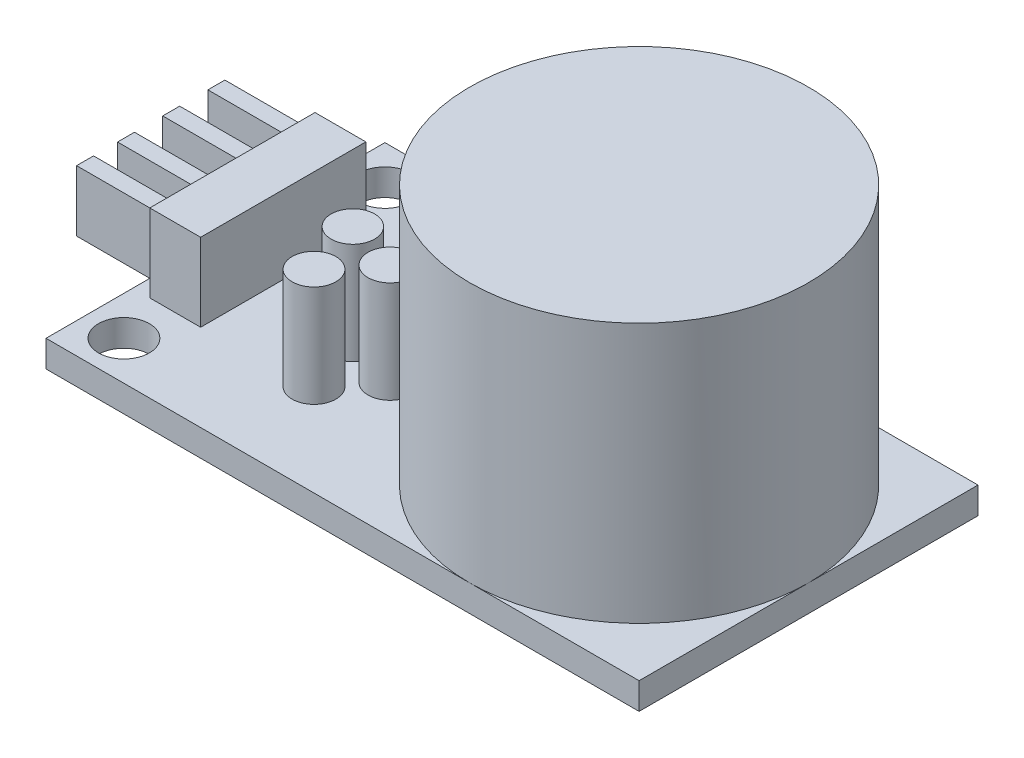
ISO-10303-21;
HEADER;
FILE_DESCRIPTION(('STEP AP214'),'2;1');
FILE_NAME('part.step','',(''),(''),'','','');
FILE_SCHEMA(('AUTOMOTIVE_DESIGN { 1 0 10303 214 1 1 1 1 }'));
ENDSEC;
DATA;
#1=APPLICATION_CONTEXT('core data for automotive mechanical design processes');
#2=APPLICATION_PROTOCOL_DEFINITION('international standard','automotive_design',2000,#1);
#3=PRODUCT_CONTEXT('',#1,'mechanical');
#4=PRODUCT('Part','Part','',(#3));
#5=PRODUCT_RELATED_PRODUCT_CATEGORY('part','',(#4));
#6=PRODUCT_DEFINITION_FORMATION('','',#4);
#7=PRODUCT_DEFINITION_CONTEXT('part definition',#1,'design');
#8=PRODUCT_DEFINITION('design','',#6,#7);
#9=PRODUCT_DEFINITION_SHAPE('','',#8);
#10=(LENGTH_UNIT() NAMED_UNIT(*) SI_UNIT(.MILLI.,.METRE.));
#11=(NAMED_UNIT(*) PLANE_ANGLE_UNIT() SI_UNIT($,.RADIAN.));
#12=(NAMED_UNIT(*) SI_UNIT($,.STERADIAN.) SOLID_ANGLE_UNIT());
#13=UNCERTAINTY_MEASURE_WITH_UNIT(LENGTH_MEASURE(1.E-05),#10,'distance_accuracy_value','');
#14=(GEOMETRIC_REPRESENTATION_CONTEXT(3) GLOBAL_UNCERTAINTY_ASSIGNED_CONTEXT((#13)) GLOBAL_UNIT_ASSIGNED_CONTEXT((#10,
#11,#12)) REPRESENTATION_CONTEXT('',''));
#15=CARTESIAN_POINT('',(0.,0.,0.));
#16=DIRECTION('',(0.,0.,1.));
#17=DIRECTION('',(1.,0.,0.));
#18=AXIS2_PLACEMENT_3D('',#15,#16,#17);
#19=CARTESIAN_POINT('',(-3.81999999999998,2.07,-14.375));
#20=DIRECTION('',(0.,1.,0.));
#21=DIRECTION('',(0.,0.,1.));
#22=AXIS2_PLACEMENT_3D('',#19,#20,#21);
#23=PLANE('',#22);
#24=DIRECTION('',(0.,0.,1.));
#25=VECTOR('',#24,1.);
#26=CARTESIAN_POINT('',(-3.81999999999998,2.07,-14.375));
#27=LINE('',#26,#25);
#28=CARTESIAN_POINT('',(-3.81999999999998,2.07,-11.7083333333333));
#29=VERTEX_POINT('',#28);
#30=CARTESIAN_POINT('',(-3.81999999999998,2.07,-10.7083333333333));
#31=VERTEX_POINT('',#30);
#32=EDGE_CURVE('E220',#29,#31,#27,.T.);
#33=ORIENTED_EDGE('',*,*,#32,.F.);
#34=DIRECTION('',(-1.,0.,0.));
#35=VECTOR('',#34,1.);
#36=CARTESIAN_POINT('',(4.96708681248318,2.07,-11.7083333333333));
#37=LINE('',#36,#35);
#38=CARTESIAN_POINT('',(1.00000000000002,2.07,-11.7083333333333));
#39=VERTEX_POINT('',#38);
#40=EDGE_CURVE('E205',#39,#29,#37,.T.);
#41=ORIENTED_EDGE('',*,*,#40,.F.);
#42=DIRECTION('',(0.,0.,1.));
#43=VECTOR('',#42,1.);
#44=CARTESIAN_POINT('',(1.00000000000002,2.07,-14.375));
#45=LINE('',#44,#43);
#46=CARTESIAN_POINT('',(1.00000000000002,2.07,-10.7083333333333));
#47=VERTEX_POINT('',#46);
#48=EDGE_CURVE('E218',#39,#47,#45,.T.);
#49=ORIENTED_EDGE('',*,*,#48,.T.);
#50=DIRECTION('',(-1.,0.,0.));
#51=VECTOR('',#50,1.);
#52=CARTESIAN_POINT('',(4.96708681248318,2.07,-10.7083333333333));
#53=LINE('',#52,#51);
#54=EDGE_CURVE('E463',#47,#31,#53,.T.);
#55=ORIENTED_EDGE('',*,*,#54,.T.);
#56=EDGE_LOOP('',(#33,#41,#49,#55));
#57=FACE_BOUND('',#56,.T.);
#58=ADVANCED_FACE('F33',(#57),#23,.F.);
#59=CARTESIAN_POINT('',(-3.81999999999998,2.07,-9.04166666666666));
#60=VERTEX_POINT('',#59);
#61=CARTESIAN_POINT('',(-3.81999999999998,2.07,-8.04166666666666));
#62=VERTEX_POINT('',#61);
#63=EDGE_CURVE('E444',#60,#62,#27,.T.);
#64=ORIENTED_EDGE('',*,*,#63,.F.);
#65=DIRECTION('',(-1.,0.,0.));
#66=VECTOR('',#65,1.);
#67=CARTESIAN_POINT('',(4.96708681248318,2.07,-9.04166666666666));
#68=LINE('',#67,#66);
#69=CARTESIAN_POINT('',(1.00000000000002,2.07,-9.04166666666666));
#70=VERTEX_POINT('',#69);
#71=EDGE_CURVE('E478',#70,#60,#68,.T.);
#72=ORIENTED_EDGE('',*,*,#71,.F.);
#73=CARTESIAN_POINT('',(1.00000000000002,2.07,-8.04166666666666));
#74=VERTEX_POINT('',#73);
#75=EDGE_CURVE('E228',#70,#74,#45,.T.);
#76=ORIENTED_EDGE('',*,*,#75,.T.);
#77=DIRECTION('',(-1.,0.,0.));
#78=VECTOR('',#77,1.);
#79=CARTESIAN_POINT('',(4.96708681248318,2.07,-8.04166666666666));
#80=LINE('',#79,#78);
#81=EDGE_CURVE('E480',#74,#62,#80,.T.);
#82=ORIENTED_EDGE('',*,*,#81,.T.);
#83=EDGE_LOOP('',(#64,#72,#76,#82));
#84=FACE_BOUND('',#83,.T.);
#85=ADVANCED_FACE('F405',(#84),#23,.F.);
#86=CARTESIAN_POINT('',(-3.81999999999998,2.07,-6.625));
#87=VERTEX_POINT('',#86);
#88=CARTESIAN_POINT('',(-3.81999999999998,2.07,-5.625));
#89=VERTEX_POINT('',#88);
#90=EDGE_CURVE('E438',#87,#89,#27,.T.);
#91=ORIENTED_EDGE('',*,*,#90,.F.);
#92=DIRECTION('',(-1.,0.,0.));
#93=VECTOR('',#92,1.);
#94=CARTESIAN_POINT('',(4.96708681248318,2.07,-6.625));
#95=LINE('',#94,#93);
#96=CARTESIAN_POINT('',(1.00000000000002,2.07,-6.625));
#97=VERTEX_POINT('',#96);
#98=EDGE_CURVE('E439',#97,#87,#95,.T.);
#99=ORIENTED_EDGE('',*,*,#98,.F.);
#100=CARTESIAN_POINT('',(1.00000000000002,2.07,-5.625));
#101=VERTEX_POINT('',#100);
#102=EDGE_CURVE('E232',#97,#101,#45,.T.);
#103=ORIENTED_EDGE('',*,*,#102,.T.);
#104=DIRECTION('',(1.,0.,0.));
#105=VECTOR('',#104,1.);
#106=CARTESIAN_POINT('',(-3.81999999999998,2.07,-5.625));
#107=LINE('',#106,#105);
#108=EDGE_CURVE('E253',#89,#101,#107,.T.);
#109=ORIENTED_EDGE('',*,*,#108,.F.);
#110=EDGE_LOOP('',(#91,#99,#103,#109));
#111=FACE_BOUND('',#110,.T.);
#112=ADVANCED_FACE('F411',(#111),#23,.F.);
#113=CARTESIAN_POINT('',(-3.81999999999998,5.67,-14.375));
#114=DIRECTION('',(0.,-1.,0.));
#115=DIRECTION('',(0.,0.,-1.));
#116=AXIS2_PLACEMENT_3D('',#113,#114,#115);
#117=PLANE('',#116);
#118=DIRECTION('',(0.,0.,-1.));
#119=VECTOR('',#118,1.);
#120=CARTESIAN_POINT('',(1.00000000000002,5.67,-14.375));
#121=LINE('',#120,#119);
#122=CARTESIAN_POINT('',(1.00000000000002,5.67,-10.7083333333333));
#123=VERTEX_POINT('',#122);
#124=CARTESIAN_POINT('',(1.00000000000002,5.67,-11.7083333333333));
#125=VERTEX_POINT('',#124);
#126=EDGE_CURVE('E525',#123,#125,#121,.T.);
#127=ORIENTED_EDGE('',*,*,#126,.T.);
#128=DIRECTION('',(-1.,0.,0.));
#129=VECTOR('',#128,1.);
#130=CARTESIAN_POINT('',(4.96708681248318,5.67,-11.7083333333333));
#131=LINE('',#130,#129);
#132=CARTESIAN_POINT('',(-3.81999999999998,5.67,-11.7083333333333));
#133=VERTEX_POINT('',#132);
#134=EDGE_CURVE('E208',#125,#133,#131,.T.);
#135=ORIENTED_EDGE('',*,*,#134,.T.);
#136=DIRECTION('',(0.,0.,-1.));
#137=VECTOR('',#136,1.);
#138=CARTESIAN_POINT('',(-3.81999999999998,5.67,-14.375));
#139=LINE('',#138,#137);
#140=CARTESIAN_POINT('',(-3.81999999999998,5.67,-10.7083333333333));
#141=VERTEX_POINT('',#140);
#142=EDGE_CURVE('E460',#141,#133,#139,.T.);
#143=ORIENTED_EDGE('',*,*,#142,.F.);
#144=DIRECTION('',(-1.,0.,0.));
#145=VECTOR('',#144,1.);
#146=CARTESIAN_POINT('',(4.96708681248318,5.67,-10.7083333333333));
#147=LINE('',#146,#145);
#148=EDGE_CURVE('E56',#123,#141,#147,.T.);
#149=ORIENTED_EDGE('',*,*,#148,.F.);
#150=EDGE_LOOP('',(#127,#135,#143,#149));
#151=FACE_BOUND('',#150,.T.);
#152=ADVANCED_FACE('F427',(#151),#117,.F.);
#153=CARTESIAN_POINT('',(1.00000000000002,5.67,-8.04166666666666));
#154=VERTEX_POINT('',#153);
#155=CARTESIAN_POINT('',(1.00000000000002,5.67,-9.04166666666666));
#156=VERTEX_POINT('',#155);
#157=EDGE_CURVE('E245',#154,#156,#121,.T.);
#158=ORIENTED_EDGE('',*,*,#157,.T.);
#159=DIRECTION('',(-1.,0.,0.));
#160=VECTOR('',#159,1.);
#161=CARTESIAN_POINT('',(4.96708681248318,5.67,-9.04166666666666));
#162=LINE('',#161,#160);
#163=CARTESIAN_POINT('',(-3.81999999999998,5.67,-9.04166666666666));
#164=VERTEX_POINT('',#163);
#165=EDGE_CURVE('E485',#156,#164,#162,.T.);
#166=ORIENTED_EDGE('',*,*,#165,.T.);
#167=CARTESIAN_POINT('',(-3.81999999999998,5.67,-8.04166666666666));
#168=VERTEX_POINT('',#167);
#169=EDGE_CURVE('E518',#168,#164,#139,.T.);
#170=ORIENTED_EDGE('',*,*,#169,.F.);
#171=DIRECTION('',(-1.,0.,0.));
#172=VECTOR('',#171,1.);
#173=CARTESIAN_POINT('',(4.96708681248318,5.67,-8.04166666666666));
#174=LINE('',#173,#172);
#175=EDGE_CURVE('E497',#154,#168,#174,.T.);
#176=ORIENTED_EDGE('',*,*,#175,.F.);
#177=EDGE_LOOP('',(#158,#166,#170,#176));
#178=FACE_BOUND('',#177,.T.);
#179=ADVANCED_FACE('F432',(#178),#117,.F.);
#180=CARTESIAN_POINT('',(1.00000000000002,5.67,-5.625));
#181=VERTEX_POINT('',#180);
#182=CARTESIAN_POINT('',(1.00000000000002,5.67,-6.625));
#183=VERTEX_POINT('',#182);
#184=EDGE_CURVE('E241',#181,#183,#121,.T.);
#185=ORIENTED_EDGE('',*,*,#184,.T.);
#186=DIRECTION('',(-1.,0.,0.));
#187=VECTOR('',#186,1.);
#188=CARTESIAN_POINT('',(4.96708681248318,5.67,-6.625));
#189=LINE('',#188,#187);
#190=CARTESIAN_POINT('',(-3.81999999999998,5.67,-6.625));
#191=VERTEX_POINT('',#190);
#192=EDGE_CURVE('E501',#183,#191,#189,.T.);
#193=ORIENTED_EDGE('',*,*,#192,.T.);
#194=CARTESIAN_POINT('',(-3.81999999999998,5.67,-5.625));
#195=VERTEX_POINT('',#194);
#196=EDGE_CURVE('E250',#195,#191,#139,.T.);
#197=ORIENTED_EDGE('',*,*,#196,.F.);
#198=DIRECTION('',(1.,0.,0.));
#199=VECTOR('',#198,1.);
#200=CARTESIAN_POINT('',(-3.81999999999998,5.67,-5.625));
#201=LINE('',#200,#199);
#202=EDGE_CURVE('E249',#195,#181,#201,.T.);
#203=ORIENTED_EDGE('',*,*,#202,.T.);
#204=EDGE_LOOP('',(#185,#193,#197,#203));
#205=FACE_BOUND('',#204,.T.);
#206=ADVANCED_FACE('F540',(#205),#117,.F.);
#207=CARTESIAN_POINT('',(-3.81999999999998,0.,0.));
#208=DIRECTION('',(-1.,0.,0.));
#209=DIRECTION('',(0.,0.,1.));
#210=AXIS2_PLACEMENT_3D('',#207,#208,#209);
#211=PLANE('',#210);
#212=DIRECTION('',(0.,1.,0.));
#213=VECTOR('',#212,1.);
#214=CARTESIAN_POINT('',(-3.81999999999998,5.67,-11.7083333333333));
#215=LINE('',#214,#213);
#216=EDGE_CURVE('E221',#29,#133,#215,.T.);
#217=ORIENTED_EDGE('',*,*,#216,.F.);
#218=ORIENTED_EDGE('',*,*,#32,.T.);
#219=DIRECTION('',(0.,-1.,0.));
#220=VECTOR('',#219,1.);
#221=CARTESIAN_POINT('',(-3.81999999999998,5.67,-10.7083333333333));
#222=LINE('',#221,#220);
#223=EDGE_CURVE('E458',#141,#31,#222,.T.);
#224=ORIENTED_EDGE('',*,*,#223,.F.);
#225=ORIENTED_EDGE('',*,*,#142,.T.);
#226=EDGE_LOOP('',(#217,#218,#224,#225));
#227=FACE_BOUND('',#226,.T.);
#228=ADVANCED_FACE('F456',(#227),#211,.T.);
#229=DIRECTION('',(0.,1.,0.));
#230=VECTOR('',#229,1.);
#231=CARTESIAN_POINT('',(-3.81999999999998,5.67,-9.04166666666666));
#232=LINE('',#231,#230);
#233=EDGE_CURVE('E476',#60,#164,#232,.T.);
#234=ORIENTED_EDGE('',*,*,#233,.F.);
#235=ORIENTED_EDGE('',*,*,#63,.T.);
#236=DIRECTION('',(0.,-1.,0.));
#237=VECTOR('',#236,1.);
#238=CARTESIAN_POINT('',(-3.81999999999998,5.67,-8.04166666666666));
#239=LINE('',#238,#237);
#240=EDGE_CURVE('E493',#168,#62,#239,.T.);
#241=ORIENTED_EDGE('',*,*,#240,.F.);
#242=ORIENTED_EDGE('',*,*,#169,.T.);
#243=EDGE_LOOP('',(#234,#235,#241,#242));
#244=FACE_BOUND('',#243,.T.);
#245=ADVANCED_FACE('F515',(#244),#211,.T.);
#246=DIRECTION('',(0.,1.,0.));
#247=VECTOR('',#246,1.);
#248=CARTESIAN_POINT('',(-3.81999999999998,5.67,-6.625));
#249=LINE('',#248,#247);
#250=EDGE_CURVE('E491',#87,#191,#249,.T.);
#251=ORIENTED_EDGE('',*,*,#250,.F.);
#252=ORIENTED_EDGE('',*,*,#90,.T.);
#253=DIRECTION('',(0.,1.,0.));
#254=VECTOR('',#253,1.);
#255=CARTESIAN_POINT('',(-3.81999999999998,5.67,-5.625));
#256=LINE('',#255,#254);
#257=EDGE_CURVE('E452',#89,#195,#256,.T.);
#258=ORIENTED_EDGE('',*,*,#257,.T.);
#259=ORIENTED_EDGE('',*,*,#196,.T.);
#260=EDGE_LOOP('',(#251,#252,#258,#259));
#261=FACE_BOUND('',#260,.T.);
#262=ADVANCED_FACE('F537',(#261),#211,.T.);
#263=CARTESIAN_POINT('',(1.00000000000002,6.17,-14.875));
#264=DIRECTION('',(1.,0.,0.));
#265=DIRECTION('',(0.,0.,-1.));
#266=AXIS2_PLACEMENT_3D('',#263,#264,#265);
#267=PLANE('',#266);
#268=ORIENTED_EDGE('',*,*,#48,.F.);
#269=DIRECTION('',(0.,1.,0.));
#270=VECTOR('',#269,1.);
#271=CARTESIAN_POINT('',(1.00000000000002,5.67,-11.7083333333333));
#272=LINE('',#271,#270);
#273=EDGE_CURVE('E202',#39,#125,#272,.T.);
#274=ORIENTED_EDGE('',*,*,#273,.T.);
#275=ORIENTED_EDGE('',*,*,#126,.F.);
#276=DIRECTION('',(0.,-1.,0.));
#277=VECTOR('',#276,1.);
#278=CARTESIAN_POINT('',(1.00000000000002,5.67,-10.7083333333333));
#279=LINE('',#278,#277);
#280=EDGE_CURVE('E225',#123,#47,#279,.T.);
#281=ORIENTED_EDGE('',*,*,#280,.T.);
#282=EDGE_LOOP('',(#268,#274,#275,#281));
#283=FACE_BOUND('',#282,.T.);
#284=ORIENTED_EDGE('',*,*,#75,.F.);
#285=DIRECTION('',(0.,1.,0.));
#286=VECTOR('',#285,1.);
#287=CARTESIAN_POINT('',(1.00000000000002,5.67,-9.04166666666666));
#288=LINE('',#287,#286);
#289=EDGE_CURVE('E482',#70,#156,#288,.T.);
#290=ORIENTED_EDGE('',*,*,#289,.T.);
#291=ORIENTED_EDGE('',*,*,#157,.F.);
#292=DIRECTION('',(0.,-1.,0.));
#293=VECTOR('',#292,1.);
#294=CARTESIAN_POINT('',(1.00000000000002,5.67,-8.04166666666666));
#295=LINE('',#294,#293);
#296=EDGE_CURVE('E495',#154,#74,#295,.T.);
#297=ORIENTED_EDGE('',*,*,#296,.T.);
#298=EDGE_LOOP('',(#284,#290,#291,#297));
#299=FACE_BOUND('',#298,.T.);
#300=ORIENTED_EDGE('',*,*,#102,.F.);
#301=DIRECTION('',(0.,1.,0.));
#302=VECTOR('',#301,1.);
#303=CARTESIAN_POINT('',(1.00000000000002,5.67,-6.625));
#304=LINE('',#303,#302);
#305=EDGE_CURVE('E498',#97,#183,#304,.T.);
#306=ORIENTED_EDGE('',*,*,#305,.T.);
#307=ORIENTED_EDGE('',*,*,#184,.F.);
#308=DIRECTION('',(0.,1.,0.));
#309=VECTOR('',#308,1.);
#310=CARTESIAN_POINT('',(1.00000000000002,5.67,-5.625));
#311=LINE('',#310,#309);
#312=EDGE_CURVE('E231',#101,#181,#311,.T.);
#313=ORIENTED_EDGE('',*,*,#312,.F.);
#314=EDGE_LOOP('',(#300,#306,#307,#313));
#315=FACE_BOUND('',#314,.T.);
#316=DIRECTION('',(0.,0.,1.));
#317=VECTOR('',#316,1.);
#318=CARTESIAN_POINT('',(1.00000000000002,1.57,-14.875));
#319=LINE('',#318,#317);
#320=CARTESIAN_POINT('',(1.00000000000002,1.57,-14.875));
#321=VERTEX_POINT('',#320);
#322=CARTESIAN_POINT('',(1.00000000000002,1.57,-5.125));
#323=VERTEX_POINT('',#322);
#324=EDGE_CURVE('E259',#321,#323,#319,.T.);
#325=ORIENTED_EDGE('',*,*,#324,.T.);
#326=DIRECTION('',(0.,-1.,0.));
#327=VECTOR('',#326,1.);
#328=CARTESIAN_POINT('',(1.00000000000002,6.17,-5.125));
#329=LINE('',#328,#327);
#330=CARTESIAN_POINT('',(1.00000000000002,6.17,-5.125));
#331=VERTEX_POINT('',#330);
#332=EDGE_CURVE('E289',#331,#323,#329,.T.);
#333=ORIENTED_EDGE('',*,*,#332,.F.);
#334=DIRECTION('',(0.,0.,1.));
#335=VECTOR('',#334,1.);
#336=CARTESIAN_POINT('',(1.00000000000002,6.17,-14.875));
#337=LINE('',#336,#335);
#338=CARTESIAN_POINT('',(1.00000000000002,6.17,-14.875));
#339=VERTEX_POINT('',#338);
#340=EDGE_CURVE('E260',#339,#331,#337,.T.);
#341=ORIENTED_EDGE('',*,*,#340,.F.);
#342=DIRECTION('',(0.,-1.,0.));
#343=VECTOR('',#342,1.);
#344=CARTESIAN_POINT('',(1.00000000000002,6.17,-14.875));
#345=LINE('',#344,#343);
#346=EDGE_CURVE('E270',#339,#321,#345,.T.);
#347=ORIENTED_EDGE('',*,*,#346,.T.);
#348=EDGE_LOOP('',(#325,#333,#341,#347));
#349=FACE_BOUND('',#348,.T.);
#350=DIRECTION('',(0.,-1.,0.));
#351=VECTOR('',#350,1.);
#352=CARTESIAN_POINT('',(1.00000000000002,5.67,-14.375));
#353=LINE('',#352,#351);
#354=CARTESIAN_POINT('',(1.00000000000002,5.67,-14.375));
#355=VERTEX_POINT('',#354);
#356=CARTESIAN_POINT('',(1.00000000000002,2.07,-14.375));
#357=VERTEX_POINT('',#356);
#358=EDGE_CURVE('E236',#355,#357,#353,.T.);
#359=ORIENTED_EDGE('',*,*,#358,.F.);
#360=CARTESIAN_POINT('',(1.00000000000002,5.67,-13.375));
#361=VERTEX_POINT('',#360);
#362=EDGE_CURVE('E240',#361,#355,#121,.T.);
#363=ORIENTED_EDGE('',*,*,#362,.F.);
#364=DIRECTION('',(0.,-1.,0.));
#365=VECTOR('',#364,1.);
#366=CARTESIAN_POINT('',(1.00000000000002,5.67,-13.375));
#367=LINE('',#366,#365);
#368=CARTESIAN_POINT('',(1.00000000000002,2.07,-13.375));
#369=VERTEX_POINT('',#368);
#370=EDGE_CURVE('E469',#361,#369,#367,.T.);
#371=ORIENTED_EDGE('',*,*,#370,.T.);
#372=EDGE_CURVE('E227',#357,#369,#45,.T.);
#373=ORIENTED_EDGE('',*,*,#372,.F.);
#374=EDGE_LOOP('',(#359,#363,#371,#373));
#375=FACE_BOUND('',#374,.T.);
#376=ADVANCED_FACE('F223',(#283,#299,#315,#349,#375),#267,.F.);
#377=CARTESIAN_POINT('',(0.,1.57,0.));
#378=DIRECTION('',(0.,-1.,0.));
#379=DIRECTION('',(0.,0.,-1.));
#380=AXIS2_PLACEMENT_3D('',#377,#378,#379);
#381=PLANE('',#380);
#382=CARTESIAN_POINT('',(9.34276181516225,1.57,-8.76625566201028));
#383=DIRECTION('',(0.,-1.,0.));
#384=DIRECTION('',(0.,0.,-1.));
#385=AXIS2_PLACEMENT_3D('',#382,#383,#384);
#386=CIRCLE('',#385,1.28479068285538);
#387=CARTESIAN_POINT('',(9.34276181516225,1.57,-10.0510463448657));
#388=VERTEX_POINT('',#387);
#389=EDGE_CURVE('E11',#388,#388,#386,.F.);
#390=ORIENTED_EDGE('',*,*,#389,.F.);
#391=EDGE_LOOP('',(#390));
#392=FACE_BOUND('',#391,.T.);
#393=CARTESIAN_POINT('',(10.3752552563492,1.57,-5.44014545158689));
#394=DIRECTION('',(0.,-1.,0.));
#395=DIRECTION('',(0.,0.,-1.));
#396=AXIS2_PLACEMENT_3D('',#393,#394,#395);
#397=CIRCLE('',#396,1.29100622203504);
#398=CARTESIAN_POINT('',(10.3752552563492,1.57,-6.73115167362192));
#399=VERTEX_POINT('',#398);
#400=EDGE_CURVE('E41',#399,#399,#397,.F.);
#401=ORIENTED_EDGE('',*,*,#400,.F.);
#402=EDGE_LOOP('',(#401));
#403=FACE_BOUND('',#402,.T.);
#404=CARTESIAN_POINT('',(11.5773723259736,1.57,-12.2105368939174));
#405=DIRECTION('',(0.,-1.,0.));
#406=DIRECTION('',(0.,0.,-1.));
#407=AXIS2_PLACEMENT_3D('',#404,#405,#406);
#408=CIRCLE('',#407,1.72084725471488);
#409=CARTESIAN_POINT('',(11.5773723259736,1.57,-13.9313841486323));
#410=VERTEX_POINT('',#409);
#411=EDGE_CURVE('E350',#410,#410,#408,.F.);
#412=ORIENTED_EDGE('',*,*,#411,.F.);
#413=EDGE_LOOP('',(#412));
#414=FACE_BOUND('',#413,.T.);
#415=CARTESIAN_POINT('',(12.40668985821,1.57,-7.89791826849751));
#416=DIRECTION('',(0.,-1.,0.));
#417=DIRECTION('',(0.,0.,-1.));
#418=AXIS2_PLACEMENT_3D('',#415,#416,#417);
#419=CIRCLE('',#418,1.2968940695084);
#420=CARTESIAN_POINT('',(12.40668985821,1.57,-9.1948123380059));
#421=VERTEX_POINT('',#420);
#422=EDGE_CURVE('E347',#421,#421,#419,.F.);
#423=ORIENTED_EDGE('',*,*,#422,.F.);
#424=EDGE_LOOP('',(#423));
#425=FACE_BOUND('',#424,.T.);
#426=CARTESIAN_POINT('',(2.3,1.57,-2.3));
#427=DIRECTION('',(0.,1.,0.));
#428=DIRECTION('',(0.,0.,1.));
#429=AXIS2_PLACEMENT_3D('',#426,#427,#428);
#430=CIRCLE('',#429,1.5);
#431=CARTESIAN_POINT('',(2.3,1.57,-0.8));
#432=VERTEX_POINT('',#431);
#433=EDGE_CURVE('E301',#432,#432,#430,.T.);
#434=ORIENTED_EDGE('',*,*,#433,.F.);
#435=EDGE_LOOP('',(#434));
#436=FACE_BOUND('',#435,.T.);
#437=CARTESIAN_POINT('',(2.3,1.57,-17.7));
#438=DIRECTION('',(0.,1.,0.));
#439=DIRECTION('',(0.,0.,1.));
#440=AXIS2_PLACEMENT_3D('',#437,#438,#439);
#441=CIRCLE('',#440,1.5);
#442=CARTESIAN_POINT('',(2.3,1.57,-16.2));
#443=VERTEX_POINT('',#442);
#444=EDGE_CURVE('E307',#443,#443,#441,.T.);
#445=ORIENTED_EDGE('',*,*,#444,.F.);
#446=EDGE_LOOP('',(#445));
#447=FACE_BOUND('',#446,.T.);
#448=CARTESIAN_POINT('',(25.,1.57,-10.));
#449=DIRECTION('',(0.,1.,0.));
#450=DIRECTION('',(0.,0.,1.));
#451=AXIS2_PLACEMENT_3D('',#448,#449,#450);
#452=CIRCLE('',#451,9.99999999999999);
#453=CARTESIAN_POINT('',(25.,1.57,-20.));
#454=VERTEX_POINT('',#453);
#455=CARTESIAN_POINT('',(25.,1.57,0.));
#456=VERTEX_POINT('',#455);
#457=EDGE_CURVE('E300',#454,#456,#452,.T.);
#458=ORIENTED_EDGE('',*,*,#457,.F.);
#459=DIRECTION('',(-1.,0.,0.));
#460=VECTOR('',#459,1.);
#461=CARTESIAN_POINT('',(0.,1.57,-20.));
#462=LINE('',#461,#460);
#463=CARTESIAN_POINT('',(0.,1.57,-20.));
#464=VERTEX_POINT('',#463);
#465=EDGE_CURVE('E324',#454,#464,#462,.T.);
#466=ORIENTED_EDGE('',*,*,#465,.T.);
#467=DIRECTION('',(0.,0.,1.));
#468=VECTOR('',#467,1.);
#469=CARTESIAN_POINT('',(0.,1.57,0.));
#470=LINE('',#469,#468);
#471=CARTESIAN_POINT('',(0.,1.57,0.));
#472=VERTEX_POINT('',#471);
#473=EDGE_CURVE('E313',#464,#472,#470,.T.);
#474=ORIENTED_EDGE('',*,*,#473,.T.);
#475=DIRECTION('',(1.,0.,0.));
#476=VECTOR('',#475,1.);
#477=CARTESIAN_POINT('',(0.,1.57,0.));
#478=LINE('',#477,#476);
#479=EDGE_CURVE('E318',#472,#456,#478,.T.);
#480=ORIENTED_EDGE('',*,*,#479,.T.);
#481=EDGE_LOOP('',(#458,#466,#474,#480));
#482=FACE_BOUND('',#481,.T.);
#483=ORIENTED_EDGE('',*,*,#324,.F.);
#484=DIRECTION('',(-1.,0.,0.));
#485=VECTOR('',#484,1.);
#486=CARTESIAN_POINT('',(1.00000000000002,1.57,-14.875));
#487=LINE('',#486,#485);
#488=CARTESIAN_POINT('',(4.00000000000002,1.57,-14.875));
#489=VERTEX_POINT('',#488);
#490=EDGE_CURVE('E264',#489,#321,#487,.T.);
#491=ORIENTED_EDGE('',*,*,#490,.F.);
#492=DIRECTION('',(0.,0.,-1.));
#493=VECTOR('',#492,1.);
#494=CARTESIAN_POINT('',(4.00000000000002,1.57,-14.875));
#495=LINE('',#494,#493);
#496=CARTESIAN_POINT('',(4.00000000000002,1.57,-5.125));
#497=VERTEX_POINT('',#496);
#498=EDGE_CURVE('E276',#497,#489,#495,.T.);
#499=ORIENTED_EDGE('',*,*,#498,.F.);
#500=DIRECTION('',(1.,0.,0.));
#501=VECTOR('',#500,1.);
#502=CARTESIAN_POINT('',(1.00000000000002,1.57,-5.125));
#503=LINE('',#502,#501);
#504=EDGE_CURVE('E273',#323,#497,#503,.T.);
#505=ORIENTED_EDGE('',*,*,#504,.F.);
#506=EDGE_LOOP('',(#483,#491,#499,#505));
#507=FACE_BOUND('',#506,.T.);
#508=ADVANCED_FACE('F357',(#392,#403,#414,#425,#436,#447,#482,#507),#381,.F.);
#509=CARTESIAN_POINT('',(35.,1.57,-10.));
#510=VERTEX_POINT('',#509);
#511=EDGE_CURVE('E292',#456,#510,#452,.T.);
#512=ORIENTED_EDGE('',*,*,#511,.F.);
#513=CARTESIAN_POINT('',(35.,1.57,0.));
#514=VERTEX_POINT('',#513);
#515=EDGE_CURVE('E316',#456,#514,#478,.T.);
#516=ORIENTED_EDGE('',*,*,#515,.T.);
#517=DIRECTION('',(0.,0.,-1.));
#518=VECTOR('',#517,1.);
#519=CARTESIAN_POINT('',(35.,1.57,0.));
#520=LINE('',#519,#518);
#521=EDGE_CURVE('E321',#514,#510,#520,.T.);
#522=ORIENTED_EDGE('',*,*,#521,.T.);
#523=EDGE_LOOP('',(#512,#516,#522));
#524=FACE_BOUND('',#523,.T.);
#525=ADVANCED_FACE('F360',(#524),#381,.F.);
#526=EDGE_CURVE('E299',#510,#454,#452,.T.);
#527=ORIENTED_EDGE('',*,*,#526,.F.);
#528=CARTESIAN_POINT('',(35.,1.57,-20.));
#529=VERTEX_POINT('',#528);
#530=EDGE_CURVE('E320',#510,#529,#520,.T.);
#531=ORIENTED_EDGE('',*,*,#530,.T.);
#532=EDGE_CURVE('E325',#529,#454,#462,.T.);
#533=ORIENTED_EDGE('',*,*,#532,.T.);
#534=EDGE_LOOP('',(#527,#531,#533));
#535=FACE_BOUND('',#534,.T.);
#536=ADVANCED_FACE('F363',(#535),#381,.F.);
#537=CARTESIAN_POINT('',(0.,0.,0.));
#538=DIRECTION('',(0.,-1.,0.));
#539=DIRECTION('',(0.,0.,-1.));
#540=AXIS2_PLACEMENT_3D('',#537,#538,#539);
#541=PLANE('',#540);
#542=CARTESIAN_POINT('',(25.,0.,-10.));
#543=DIRECTION('',(0.,-1.,0.));
#544=DIRECTION('',(0.,0.,-1.));
#545=AXIS2_PLACEMENT_3D('',#542,#543,#544);
#546=CIRCLE('',#545,2.5);
#547=CARTESIAN_POINT('',(25.,0.,-12.5));
#548=VERTEX_POINT('',#547);
#549=EDGE_CURVE('E828',#548,#548,#546,.T.);
#550=ORIENTED_EDGE('',*,*,#549,.F.);
#551=EDGE_LOOP('',(#550));
#552=FACE_BOUND('',#551,.T.);
#553=CARTESIAN_POINT('',(2.3,0.,-17.7));
#554=DIRECTION('',(0.,1.,0.));
#555=DIRECTION('',(0.,0.,1.));
#556=AXIS2_PLACEMENT_3D('',#553,#554,#555);
#557=CIRCLE('',#556,1.5);
#558=CARTESIAN_POINT('',(2.3,0.,-16.2));
#559=VERTEX_POINT('',#558);
#560=EDGE_CURVE('E304',#559,#559,#557,.T.);
#561=ORIENTED_EDGE('',*,*,#560,.T.);
#562=EDGE_LOOP('',(#561));
#563=FACE_BOUND('',#562,.T.);
#564=DIRECTION('',(0.,0.,1.));
#565=VECTOR('',#564,1.);
#566=CARTESIAN_POINT('',(0.,0.,0.));
#567=LINE('',#566,#565);
#568=CARTESIAN_POINT('',(0.,0.,-20.));
#569=VERTEX_POINT('',#568);
#570=CARTESIAN_POINT('',(0.,0.,0.));
#571=VERTEX_POINT('',#570);
#572=EDGE_CURVE('E310',#569,#571,#567,.T.);
#573=ORIENTED_EDGE('',*,*,#572,.F.);
#574=DIRECTION('',(-1.,0.,0.));
#575=VECTOR('',#574,1.);
#576=CARTESIAN_POINT('',(0.,0.,-20.));
#577=LINE('',#576,#575);
#578=CARTESIAN_POINT('',(35.,0.,-20.));
#579=VERTEX_POINT('',#578);
#580=EDGE_CURVE('E317',#579,#569,#577,.T.);
#581=ORIENTED_EDGE('',*,*,#580,.F.);
#582=DIRECTION('',(0.,0.,-1.));
#583=VECTOR('',#582,1.);
#584=CARTESIAN_POINT('',(35.,0.,0.));
#585=LINE('',#584,#583);
#586=CARTESIAN_POINT('',(35.,0.,0.));
#587=VERTEX_POINT('',#586);
#588=EDGE_CURVE('E333',#587,#579,#585,.T.);
#589=ORIENTED_EDGE('',*,*,#588,.F.);
#590=DIRECTION('',(1.,0.,0.));
#591=VECTOR('',#590,1.);
#592=CARTESIAN_POINT('',(0.,0.,0.));
#593=LINE('',#592,#591);
#594=EDGE_CURVE('E331',#571,#587,#593,.T.);
#595=ORIENTED_EDGE('',*,*,#594,.F.);
#596=EDGE_LOOP('',(#573,#581,#589,#595));
#597=FACE_BOUND('',#596,.T.);
#598=CARTESIAN_POINT('',(2.3,0.,-2.3));
#599=DIRECTION('',(0.,1.,0.));
#600=DIRECTION('',(0.,0.,1.));
#601=AXIS2_PLACEMENT_3D('',#598,#599,#600);
#602=CIRCLE('',#601,1.5);
#603=CARTESIAN_POINT('',(2.3,0.,-0.8));
#604=VERTEX_POINT('',#603);
#605=EDGE_CURVE('E296',#604,#604,#602,.T.);
#606=ORIENTED_EDGE('',*,*,#605,.T.);
#607=EDGE_LOOP('',(#606));
#608=FACE_BOUND('',#607,.T.);
#609=ADVANCED_FACE('F564',(#552,#563,#597,#608),#541,.T.);
#610=CARTESIAN_POINT('',(0.,1.57,0.));
#611=DIRECTION('',(1.,0.,0.));
#612=DIRECTION('',(0.,0.,-1.));
#613=AXIS2_PLACEMENT_3D('',#610,#611,#612);
#614=PLANE('',#613);
#615=ORIENTED_EDGE('',*,*,#572,.T.);
#616=DIRECTION('',(0.,-1.,0.));
#617=VECTOR('',#616,1.);
#618=CARTESIAN_POINT('',(0.,1.57,0.));
#619=LINE('',#618,#617);
#620=EDGE_CURVE('E344',#472,#571,#619,.T.);
#621=ORIENTED_EDGE('',*,*,#620,.F.);
#622=ORIENTED_EDGE('',*,*,#473,.F.);
#623=DIRECTION('',(0.,-1.,0.));
#624=VECTOR('',#623,1.);
#625=CARTESIAN_POINT('',(0.,1.57,-20.));
#626=LINE('',#625,#624);
#627=EDGE_CURVE('E328',#464,#569,#626,.T.);
#628=ORIENTED_EDGE('',*,*,#627,.T.);
#629=EDGE_LOOP('',(#615,#621,#622,#628));
#630=FACE_BOUND('',#629,.T.);
#631=ADVANCED_FACE('F35',(#630),#614,.F.);
#632=CARTESIAN_POINT('',(0.,1.57,0.));
#633=DIRECTION('',(0.,0.,-1.));
#634=DIRECTION('',(-1.,0.,0.));
#635=AXIS2_PLACEMENT_3D('',#632,#633,#634);
#636=PLANE('',#635);
#637=ORIENTED_EDGE('',*,*,#594,.T.);
#638=DIRECTION('',(0.,-1.,0.));
#639=VECTOR('',#638,1.);
#640=CARTESIAN_POINT('',(35.,1.57,0.));
#641=LINE('',#640,#639);
#642=EDGE_CURVE('E341',#514,#587,#641,.T.);
#643=ORIENTED_EDGE('',*,*,#642,.F.);
#644=ORIENTED_EDGE('',*,*,#515,.F.);
#645=ORIENTED_EDGE('',*,*,#479,.F.);
#646=ORIENTED_EDGE('',*,*,#620,.T.);
#647=EDGE_LOOP('',(#637,#643,#644,#645,#646));
#648=FACE_BOUND('',#647,.T.);
#649=ADVANCED_FACE('F573',(#648),#636,.F.);
#650=CARTESIAN_POINT('',(35.,1.57,0.));
#651=DIRECTION('',(-1.,0.,0.));
#652=DIRECTION('',(0.,0.,1.));
#653=AXIS2_PLACEMENT_3D('',#650,#651,#652);
#654=PLANE('',#653);
#655=ORIENTED_EDGE('',*,*,#588,.T.);
#656=DIRECTION('',(0.,-1.,0.));
#657=VECTOR('',#656,1.);
#658=CARTESIAN_POINT('',(35.,1.57,-20.));
#659=LINE('',#658,#657);
#660=EDGE_CURVE('E338',#529,#579,#659,.T.);
#661=ORIENTED_EDGE('',*,*,#660,.F.);
#662=ORIENTED_EDGE('',*,*,#530,.F.);
#663=ORIENTED_EDGE('',*,*,#521,.F.);
#664=ORIENTED_EDGE('',*,*,#642,.T.);
#665=EDGE_LOOP('',(#655,#661,#662,#663,#664));
#666=FACE_BOUND('',#665,.T.);
#667=ADVANCED_FACE('F570',(#666),#654,.F.);
#668=CARTESIAN_POINT('',(0.,1.57,-20.));
#669=DIRECTION('',(0.,0.,1.));
#670=DIRECTION('',(1.,0.,0.));
#671=AXIS2_PLACEMENT_3D('',#668,#669,#670);
#672=PLANE('',#671);
#673=ORIENTED_EDGE('',*,*,#580,.T.);
#674=ORIENTED_EDGE('',*,*,#627,.F.);
#675=ORIENTED_EDGE('',*,*,#465,.F.);
#676=ORIENTED_EDGE('',*,*,#532,.F.);
#677=ORIENTED_EDGE('',*,*,#660,.T.);
#678=EDGE_LOOP('',(#673,#674,#675,#676,#677));
#679=FACE_BOUND('',#678,.T.);
#680=ADVANCED_FACE('F561',(#679),#672,.F.);
#681=CARTESIAN_POINT('',(2.3,1.57,-17.7));
#682=DIRECTION('',(0.,-1.,0.));
#683=DIRECTION('',(0.,0.,-1.));
#684=AXIS2_PLACEMENT_3D('',#681,#682,#683);
#685=CYLINDRICAL_SURFACE('',#684,1.5);
#686=ORIENTED_EDGE('',*,*,#444,.T.);
#687=EDGE_LOOP('',(#686));
#688=FACE_BOUND('',#687,.T.);
#689=ORIENTED_EDGE('',*,*,#560,.F.);
#690=EDGE_LOOP('',(#689));
#691=FACE_BOUND('',#690,.T.);
#692=ADVANCED_FACE('F558',(#688,#691),#685,.F.);
#693=CARTESIAN_POINT('',(2.3,1.57,-2.3));
#694=DIRECTION('',(0.,-1.,0.));
#695=DIRECTION('',(0.,0.,-1.));
#696=AXIS2_PLACEMENT_3D('',#693,#694,#695);
#697=CYLINDRICAL_SURFACE('',#696,1.5);
#698=ORIENTED_EDGE('',*,*,#433,.T.);
#699=EDGE_LOOP('',(#698));
#700=FACE_BOUND('',#699,.T.);
#701=ORIENTED_EDGE('',*,*,#605,.F.);
#702=EDGE_LOOP('',(#701));
#703=FACE_BOUND('',#702,.T.);
#704=ADVANCED_FACE('F554',(#700,#703),#697,.F.);
#705=CARTESIAN_POINT('',(25.,16.91,-10.));
#706=DIRECTION('',(0.,-1.,0.));
#707=DIRECTION('',(0.,0.,-1.));
#708=AXIS2_PLACEMENT_3D('',#705,#706,#707);
#709=CYLINDRICAL_SURFACE('',#708,9.99999999999999);
#710=CARTESIAN_POINT('',(25.,16.91,-10.));
#711=DIRECTION('',(0.,1.,0.));
#712=DIRECTION('',(0.,0.,1.));
#713=AXIS2_PLACEMENT_3D('',#710,#711,#712);
#714=CIRCLE('',#713,9.99999999999999);
#715=CARTESIAN_POINT('',(25.,16.91,0.));
#716=VERTEX_POINT('',#715);
#717=EDGE_CURVE('E293',#716,#716,#714,.T.);
#718=ORIENTED_EDGE('',*,*,#717,.F.);
#719=EDGE_LOOP('',(#718));
#720=FACE_BOUND('',#719,.T.);
#721=ORIENTED_EDGE('',*,*,#511,.T.);
#722=ORIENTED_EDGE('',*,*,#526,.T.);
#723=ORIENTED_EDGE('',*,*,#457,.T.);
#724=EDGE_LOOP('',(#721,#722,#723));
#725=FACE_BOUND('',#724,.T.);
#726=ADVANCED_FACE('F400',(#720,#725),#709,.T.);
#727=CARTESIAN_POINT('',(25.,16.91,-10.));
#728=DIRECTION('',(0.,1.,0.));
#729=DIRECTION('',(0.,0.,1.));
#730=AXIS2_PLACEMENT_3D('',#727,#728,#729);
#731=PLANE('',#730);
#732=ORIENTED_EDGE('',*,*,#717,.T.);
#733=EDGE_LOOP('',(#732));
#734=FACE_BOUND('',#733,.T.);
#735=ADVANCED_FACE('F393',(#734),#731,.T.);
#736=CARTESIAN_POINT('',(1.00000000000002,6.17,-5.125));
#737=DIRECTION('',(0.,0.,-1.));
#738=DIRECTION('',(-1.,0.,0.));
#739=AXIS2_PLACEMENT_3D('',#736,#737,#738);
#740=PLANE('',#739);
#741=ORIENTED_EDGE('',*,*,#504,.T.);
#742=DIRECTION('',(0.,-1.,0.));
#743=VECTOR('',#742,1.);
#744=CARTESIAN_POINT('',(4.00000000000002,6.17,-5.125));
#745=LINE('',#744,#743);
#746=CARTESIAN_POINT('',(4.00000000000002,6.17,-5.125));
#747=VERTEX_POINT('',#746);
#748=EDGE_CURVE('E286',#747,#497,#745,.T.);
#749=ORIENTED_EDGE('',*,*,#748,.F.);
#750=DIRECTION('',(1.,0.,0.));
#751=VECTOR('',#750,1.);
#752=CARTESIAN_POINT('',(1.00000000000002,6.17,-5.125));
#753=LINE('',#752,#751);
#754=EDGE_CURVE('E263',#331,#747,#753,.T.);
#755=ORIENTED_EDGE('',*,*,#754,.F.);
#756=ORIENTED_EDGE('',*,*,#332,.T.);
#757=EDGE_LOOP('',(#741,#749,#755,#756));
#758=FACE_BOUND('',#757,.T.);
#759=ADVANCED_FACE('F391',(#758),#740,.F.);
#760=CARTESIAN_POINT('',(4.00000000000002,6.17,-14.875));
#761=DIRECTION('',(-1.,0.,0.));
#762=DIRECTION('',(0.,0.,1.));
#763=AXIS2_PLACEMENT_3D('',#760,#761,#762);
#764=PLANE('',#763);
#765=ORIENTED_EDGE('',*,*,#498,.T.);
#766=DIRECTION('',(0.,-1.,0.));
#767=VECTOR('',#766,1.);
#768=CARTESIAN_POINT('',(4.00000000000002,6.17,-14.875));
#769=LINE('',#768,#767);
#770=CARTESIAN_POINT('',(4.00000000000002,6.17,-14.875));
#771=VERTEX_POINT('',#770);
#772=EDGE_CURVE('E283',#771,#489,#769,.T.);
#773=ORIENTED_EDGE('',*,*,#772,.F.);
#774=DIRECTION('',(0.,0.,-1.));
#775=VECTOR('',#774,1.);
#776=CARTESIAN_POINT('',(4.00000000000002,6.17,-14.875));
#777=LINE('',#776,#775);
#778=EDGE_CURVE('E266',#747,#771,#777,.T.);
#779=ORIENTED_EDGE('',*,*,#778,.F.);
#780=ORIENTED_EDGE('',*,*,#748,.T.);
#781=EDGE_LOOP('',(#765,#773,#779,#780));
#782=FACE_BOUND('',#781,.T.);
#783=ADVANCED_FACE('F389',(#782),#764,.F.);
#784=CARTESIAN_POINT('',(1.00000000000002,6.17,-14.875));
#785=DIRECTION('',(0.,0.,1.));
#786=DIRECTION('',(1.,0.,0.));
#787=AXIS2_PLACEMENT_3D('',#784,#785,#786);
#788=PLANE('',#787);
#789=ORIENTED_EDGE('',*,*,#490,.T.);
#790=ORIENTED_EDGE('',*,*,#346,.F.);
#791=DIRECTION('',(-1.,0.,0.));
#792=VECTOR('',#791,1.);
#793=CARTESIAN_POINT('',(1.00000000000002,6.17,-14.875));
#794=LINE('',#793,#792);
#795=EDGE_CURVE('E268',#771,#339,#794,.T.);
#796=ORIENTED_EDGE('',*,*,#795,.F.);
#797=ORIENTED_EDGE('',*,*,#772,.T.);
#798=EDGE_LOOP('',(#789,#790,#796,#797));
#799=FACE_BOUND('',#798,.T.);
#800=ADVANCED_FACE('F379',(#799),#788,.F.);
#801=CARTESIAN_POINT('',(0.,6.17,0.));
#802=DIRECTION('',(0.,1.,0.));
#803=DIRECTION('',(0.,0.,1.));
#804=AXIS2_PLACEMENT_3D('',#801,#802,#803);
#805=PLANE('',#804);
#806=ORIENTED_EDGE('',*,*,#340,.T.);
#807=ORIENTED_EDGE('',*,*,#754,.T.);
#808=ORIENTED_EDGE('',*,*,#778,.T.);
#809=ORIENTED_EDGE('',*,*,#795,.T.);
#810=EDGE_LOOP('',(#806,#807,#808,#809));
#811=FACE_BOUND('',#810,.T.);
#812=ADVANCED_FACE('F385',(#811),#805,.T.);
#813=CARTESIAN_POINT('',(-3.81999999999998,5.67,-14.375));
#814=DIRECTION('',(0.,0.,1.));
#815=DIRECTION('',(1.,0.,0.));
#816=AXIS2_PLACEMENT_3D('',#813,#814,#815);
#817=PLANE('',#816);
#818=ORIENTED_EDGE('',*,*,#358,.T.);
#819=DIRECTION('',(1.,0.,0.));
#820=VECTOR('',#819,1.);
#821=CARTESIAN_POINT('',(-3.81999999999998,2.07,-14.375));
#822=LINE('',#821,#820);
#823=CARTESIAN_POINT('',(-3.81999999999998,2.07,-14.375));
#824=VERTEX_POINT('',#823);
#825=EDGE_CURVE('E256',#824,#357,#822,.T.);
#826=ORIENTED_EDGE('',*,*,#825,.F.);
#827=DIRECTION('',(0.,-1.,0.));
#828=VECTOR('',#827,1.);
#829=CARTESIAN_POINT('',(-3.81999999999998,5.67,-14.375));
#830=LINE('',#829,#828);
#831=CARTESIAN_POINT('',(-3.81999999999998,5.67,-14.375));
#832=VERTEX_POINT('',#831);
#833=EDGE_CURVE('E244',#832,#824,#830,.T.);
#834=ORIENTED_EDGE('',*,*,#833,.F.);
#835=DIRECTION('',(1.,0.,0.));
#836=VECTOR('',#835,1.);
#837=CARTESIAN_POINT('',(-3.81999999999998,5.67,-14.375));
#838=LINE('',#837,#836);
#839=EDGE_CURVE('E246',#832,#355,#838,.T.);
#840=ORIENTED_EDGE('',*,*,#839,.T.);
#841=EDGE_LOOP('',(#818,#826,#834,#840));
#842=FACE_BOUND('',#841,.T.);
#843=ADVANCED_FACE('F417',(#842),#817,.F.);
#844=ORIENTED_EDGE('',*,*,#372,.T.);
#845=DIRECTION('',(-1.,0.,0.));
#846=VECTOR('',#845,1.);
#847=CARTESIAN_POINT('',(4.96708681248318,2.07,-13.375));
#848=LINE('',#847,#846);
#849=CARTESIAN_POINT('',(-3.81999999999998,2.07,-13.375));
#850=VERTEX_POINT('',#849);
#851=EDGE_CURVE('E470',#369,#850,#848,.T.);
#852=ORIENTED_EDGE('',*,*,#851,.T.);
#853=EDGE_CURVE('E446',#824,#850,#27,.T.);
#854=ORIENTED_EDGE('',*,*,#853,.F.);
#855=ORIENTED_EDGE('',*,*,#825,.T.);
#856=EDGE_LOOP('',(#844,#852,#854,#855));
#857=FACE_BOUND('',#856,.T.);
#858=ADVANCED_FACE('F407',(#857),#23,.F.);
#859=CARTESIAN_POINT('',(-3.81999999999998,5.67,-5.625));
#860=DIRECTION('',(0.,0.,-1.));
#861=DIRECTION('',(-1.,0.,0.));
#862=AXIS2_PLACEMENT_3D('',#859,#860,#861);
#863=PLANE('',#862);
#864=ORIENTED_EDGE('',*,*,#312,.T.);
#865=ORIENTED_EDGE('',*,*,#202,.F.);
#866=ORIENTED_EDGE('',*,*,#257,.F.);
#867=ORIENTED_EDGE('',*,*,#108,.T.);
#868=EDGE_LOOP('',(#864,#865,#866,#867));
#869=FACE_BOUND('',#868,.T.);
#870=ADVANCED_FACE('F416',(#869),#863,.F.);
#871=CARTESIAN_POINT('',(-3.81999999999998,5.67,-13.375));
#872=VERTEX_POINT('',#871);
#873=EDGE_CURVE('E454',#872,#832,#139,.T.);
#874=ORIENTED_EDGE('',*,*,#873,.F.);
#875=DIRECTION('',(-1.,0.,0.));
#876=VECTOR('',#875,1.);
#877=CARTESIAN_POINT('',(4.96708681248318,5.67,-13.375));
#878=LINE('',#877,#876);
#879=EDGE_CURVE('E48',#361,#872,#878,.T.);
#880=ORIENTED_EDGE('',*,*,#879,.F.);
#881=ORIENTED_EDGE('',*,*,#362,.T.);
#882=ORIENTED_EDGE('',*,*,#839,.F.);
#883=EDGE_LOOP('',(#874,#880,#881,#882));
#884=FACE_BOUND('',#883,.T.);
#885=ADVANCED_FACE('F423',(#884),#117,.F.);
#886=DIRECTION('',(0.,-1.,0.));
#887=VECTOR('',#886,1.);
#888=CARTESIAN_POINT('',(-3.81999999999998,5.67,-13.375));
#889=LINE('',#888,#887);
#890=EDGE_CURVE('E461',#872,#850,#889,.T.);
#891=ORIENTED_EDGE('',*,*,#890,.F.);
#892=ORIENTED_EDGE('',*,*,#873,.T.);
#893=ORIENTED_EDGE('',*,*,#833,.T.);
#894=ORIENTED_EDGE('',*,*,#853,.T.);
#895=EDGE_LOOP('',(#891,#892,#893,#894));
#896=FACE_BOUND('',#895,.T.);
#897=ADVANCED_FACE('F534',(#896),#211,.T.);
#898=CARTESIAN_POINT('',(4.96708681248318,5.67,-6.625));
#899=DIRECTION('',(0.,0.,1.));
#900=DIRECTION('',(1.,0.,0.));
#901=AXIS2_PLACEMENT_3D('',#898,#899,#900);
#902=PLANE('',#901);
#903=ORIENTED_EDGE('',*,*,#98,.T.);
#904=ORIENTED_EDGE('',*,*,#250,.T.);
#905=ORIENTED_EDGE('',*,*,#192,.F.);
#906=ORIENTED_EDGE('',*,*,#305,.F.);
#907=EDGE_LOOP('',(#903,#904,#905,#906));
#908=FACE_BOUND('',#907,.T.);
#909=ADVANCED_FACE('F542',(#908),#902,.F.);
#910=CARTESIAN_POINT('',(4.96708681248318,5.67,-8.04166666666666));
#911=DIRECTION('',(0.,0.,-1.));
#912=DIRECTION('',(-1.,0.,0.));
#913=AXIS2_PLACEMENT_3D('',#910,#911,#912);
#914=PLANE('',#913);
#915=ORIENTED_EDGE('',*,*,#175,.T.);
#916=ORIENTED_EDGE('',*,*,#240,.T.);
#917=ORIENTED_EDGE('',*,*,#81,.F.);
#918=ORIENTED_EDGE('',*,*,#296,.F.);
#919=EDGE_LOOP('',(#915,#916,#917,#918));
#920=FACE_BOUND('',#919,.T.);
#921=ADVANCED_FACE('F771',(#920),#914,.F.);
#922=CARTESIAN_POINT('',(4.96708681248318,5.67,-9.04166666666666));
#923=DIRECTION('',(0.,0.,1.));
#924=DIRECTION('',(1.,0.,0.));
#925=AXIS2_PLACEMENT_3D('',#922,#923,#924);
#926=PLANE('',#925);
#927=ORIENTED_EDGE('',*,*,#71,.T.);
#928=ORIENTED_EDGE('',*,*,#233,.T.);
#929=ORIENTED_EDGE('',*,*,#165,.F.);
#930=ORIENTED_EDGE('',*,*,#289,.F.);
#931=EDGE_LOOP('',(#927,#928,#929,#930));
#932=FACE_BOUND('',#931,.T.);
#933=ADVANCED_FACE('F520',(#932),#926,.F.);
#934=CARTESIAN_POINT('',(4.96708681248318,5.67,-10.7083333333333));
#935=DIRECTION('',(0.,0.,-1.));
#936=DIRECTION('',(-1.,0.,0.));
#937=AXIS2_PLACEMENT_3D('',#934,#935,#936);
#938=PLANE('',#937);
#939=ORIENTED_EDGE('',*,*,#148,.T.);
#940=ORIENTED_EDGE('',*,*,#223,.T.);
#941=ORIENTED_EDGE('',*,*,#54,.F.);
#942=ORIENTED_EDGE('',*,*,#280,.F.);
#943=EDGE_LOOP('',(#939,#940,#941,#942));
#944=FACE_BOUND('',#943,.T.);
#945=ADVANCED_FACE('F776',(#944),#938,.F.);
#946=CARTESIAN_POINT('',(4.96708681248318,5.67,-11.7083333333333));
#947=DIRECTION('',(0.,0.,1.));
#948=DIRECTION('',(1.,0.,0.));
#949=AXIS2_PLACEMENT_3D('',#946,#947,#948);
#950=PLANE('',#949);
#951=ORIENTED_EDGE('',*,*,#40,.T.);
#952=ORIENTED_EDGE('',*,*,#216,.T.);
#953=ORIENTED_EDGE('',*,*,#134,.F.);
#954=ORIENTED_EDGE('',*,*,#273,.F.);
#955=EDGE_LOOP('',(#951,#952,#953,#954));
#956=FACE_BOUND('',#955,.T.);
#957=ADVANCED_FACE('F204',(#956),#950,.F.);
#958=CARTESIAN_POINT('',(4.96708681248318,5.67,-13.375));
#959=DIRECTION('',(0.,0.,-1.));
#960=DIRECTION('',(-1.,0.,0.));
#961=AXIS2_PLACEMENT_3D('',#958,#959,#960);
#962=PLANE('',#961);
#963=ORIENTED_EDGE('',*,*,#879,.T.);
#964=ORIENTED_EDGE('',*,*,#890,.T.);
#965=ORIENTED_EDGE('',*,*,#851,.F.);
#966=ORIENTED_EDGE('',*,*,#370,.F.);
#967=EDGE_LOOP('',(#963,#964,#965,#966));
#968=FACE_BOUND('',#967,.T.);
#969=ADVANCED_FACE('F781',(#968),#962,.F.);
#970=CARTESIAN_POINT('',(12.40668985821,7.57,-7.89791826849751));
#971=DIRECTION('',(0.,-1.,0.));
#972=DIRECTION('',(0.,0.,-1.));
#973=AXIS2_PLACEMENT_3D('',#970,#971,#972);
#974=CYLINDRICAL_SURFACE('',#973,1.2968940695084);
#975=CARTESIAN_POINT('',(12.40668985821,7.57,-7.89791826849751));
#976=DIRECTION('',(0.,1.,0.));
#977=DIRECTION('',(0.,0.,1.));
#978=AXIS2_PLACEMENT_3D('',#975,#976,#977);
#979=CIRCLE('',#978,1.2968940695084);
#980=CARTESIAN_POINT('',(12.40668985821,7.57,-6.60102419898911));
#981=VERTEX_POINT('',#980);
#982=EDGE_CURVE('E466',#981,#981,#979,.T.);
#983=ORIENTED_EDGE('',*,*,#982,.F.);
#984=EDGE_LOOP('',(#983));
#985=FACE_BOUND('',#984,.T.);
#986=ORIENTED_EDGE('',*,*,#422,.T.);
#987=EDGE_LOOP('',(#986));
#988=FACE_BOUND('',#987,.T.);
#989=ADVANCED_FACE('F784',(#985,#988),#974,.T.);
#990=CARTESIAN_POINT('',(12.40668985821,7.57,-7.89791826849751));
#991=DIRECTION('',(0.,1.,0.));
#992=DIRECTION('',(0.,0.,1.));
#993=AXIS2_PLACEMENT_3D('',#990,#991,#992);
#994=PLANE('',#993);
#995=ORIENTED_EDGE('',*,*,#982,.T.);
#996=EDGE_LOOP('',(#995));
#997=FACE_BOUND('',#996,.T.);
#998=ADVANCED_FACE('F787',(#997),#994,.T.);
#999=CARTESIAN_POINT('',(11.5773723259736,7.57,-12.2105368939174));
#1000=DIRECTION('',(0.,-1.,0.));
#1001=DIRECTION('',(0.,0.,-1.));
#1002=AXIS2_PLACEMENT_3D('',#999,#1000,#1001);
#1003=CYLINDRICAL_SURFACE('',#1002,1.72084725471488);
#1004=CARTESIAN_POINT('',(11.5773723259736,7.57,-12.2105368939174));
#1005=DIRECTION('',(0.,1.,0.));
#1006=DIRECTION('',(0.,0.,1.));
#1007=AXIS2_PLACEMENT_3D('',#1004,#1005,#1006);
#1008=CIRCLE('',#1007,1.72084725471488);
#1009=CARTESIAN_POINT('',(11.5773723259736,7.57,-10.4896896392025));
#1010=VERTEX_POINT('',#1009);
#1011=EDGE_CURVE('E837',#1010,#1010,#1008,.T.);
#1012=ORIENTED_EDGE('',*,*,#1011,.F.);
#1013=EDGE_LOOP('',(#1012));
#1014=FACE_BOUND('',#1013,.T.);
#1015=ORIENTED_EDGE('',*,*,#411,.T.);
#1016=EDGE_LOOP('',(#1015));
#1017=FACE_BOUND('',#1016,.T.);
#1018=ADVANCED_FACE('F791',(#1014,#1017),#1003,.T.);
#1019=CARTESIAN_POINT('',(11.5773723259736,7.57,-12.2105368939174));
#1020=DIRECTION('',(0.,1.,0.));
#1021=DIRECTION('',(0.,0.,1.));
#1022=AXIS2_PLACEMENT_3D('',#1019,#1020,#1021);
#1023=PLANE('',#1022);
#1024=ORIENTED_EDGE('',*,*,#1011,.T.);
#1025=EDGE_LOOP('',(#1024));
#1026=FACE_BOUND('',#1025,.T.);
#1027=ADVANCED_FACE('F795',(#1026),#1023,.T.);
#1028=CARTESIAN_POINT('',(10.3752552563492,7.57,-5.44014545158689));
#1029=DIRECTION('',(0.,-1.,0.));
#1030=DIRECTION('',(0.,0.,-1.));
#1031=AXIS2_PLACEMENT_3D('',#1028,#1029,#1030);
#1032=CYLINDRICAL_SURFACE('',#1031,1.29100622203504);
#1033=CARTESIAN_POINT('',(10.3752552563492,7.57,-5.44014545158689));
#1034=DIRECTION('',(0.,1.,0.));
#1035=DIRECTION('',(0.,0.,1.));
#1036=AXIS2_PLACEMENT_3D('',#1033,#1034,#1035);
#1037=CIRCLE('',#1036,1.29100622203504);
#1038=CARTESIAN_POINT('',(10.3752552563492,7.57,-4.14913922955185));
#1039=VERTEX_POINT('',#1038);
#1040=EDGE_CURVE('E831',#1039,#1039,#1037,.T.);
#1041=ORIENTED_EDGE('',*,*,#1040,.F.);
#1042=EDGE_LOOP('',(#1041));
#1043=FACE_BOUND('',#1042,.T.);
#1044=ORIENTED_EDGE('',*,*,#400,.T.);
#1045=EDGE_LOOP('',(#1044));
#1046=FACE_BOUND('',#1045,.T.);
#1047=ADVANCED_FACE('F355',(#1043,#1046),#1032,.T.);
#1048=CARTESIAN_POINT('',(10.3752552563492,7.57,-5.44014545158689));
#1049=DIRECTION('',(0.,1.,0.));
#1050=DIRECTION('',(0.,0.,1.));
#1051=AXIS2_PLACEMENT_3D('',#1048,#1049,#1050);
#1052=PLANE('',#1051);
#1053=ORIENTED_EDGE('',*,*,#1040,.T.);
#1054=EDGE_LOOP('',(#1053));
#1055=FACE_BOUND('',#1054,.T.);
#1056=ADVANCED_FACE('F802',(#1055),#1052,.T.);
#1057=CARTESIAN_POINT('',(9.34276181516225,7.57,-8.76625566201028));
#1058=DIRECTION('',(0.,-1.,0.));
#1059=DIRECTION('',(0.,0.,-1.));
#1060=AXIS2_PLACEMENT_3D('',#1057,#1058,#1059);
#1061=CYLINDRICAL_SURFACE('',#1060,1.28479068285538);
#1062=CARTESIAN_POINT('',(9.34276181516225,7.57,-8.76625566201028));
#1063=DIRECTION('',(0.,1.,0.));
#1064=DIRECTION('',(0.,0.,1.));
#1065=AXIS2_PLACEMENT_3D('',#1062,#1063,#1064);
#1066=CIRCLE('',#1065,1.28479068285538);
#1067=CARTESIAN_POINT('',(9.34276181516225,7.57,-7.4814649791549));
#1068=VERTEX_POINT('',#1067);
#1069=EDGE_CURVE('E827',#1068,#1068,#1066,.T.);
#1070=ORIENTED_EDGE('',*,*,#1069,.F.);
#1071=EDGE_LOOP('',(#1070));
#1072=FACE_BOUND('',#1071,.T.);
#1073=ORIENTED_EDGE('',*,*,#389,.T.);
#1074=EDGE_LOOP('',(#1073));
#1075=FACE_BOUND('',#1074,.T.);
#1076=ADVANCED_FACE('F806',(#1072,#1075),#1061,.T.);
#1077=CARTESIAN_POINT('',(9.34276181516225,7.57,-8.76625566201028));
#1078=DIRECTION('',(0.,1.,0.));
#1079=DIRECTION('',(0.,0.,1.));
#1080=AXIS2_PLACEMENT_3D('',#1077,#1078,#1079);
#1081=PLANE('',#1080);
#1082=ORIENTED_EDGE('',*,*,#1069,.T.);
#1083=EDGE_LOOP('',(#1082));
#1084=FACE_BOUND('',#1083,.T.);
#1085=ADVANCED_FACE('F810',(#1084),#1081,.T.);
#1086=CARTESIAN_POINT('',(25.,-2.,-10.));
#1087=DIRECTION('',(0.,1.,0.));
#1088=DIRECTION('',(0.,0.,1.));
#1089=AXIS2_PLACEMENT_3D('',#1086,#1087,#1088);
#1090=CYLINDRICAL_SURFACE('',#1089,2.5);
#1091=CARTESIAN_POINT('',(25.,-2.,-10.));
#1092=DIRECTION('',(0.,-1.,0.));
#1093=DIRECTION('',(0.,0.,-1.));
#1094=AXIS2_PLACEMENT_3D('',#1091,#1092,#1093);
#1095=CIRCLE('',#1094,2.5);
#1096=CARTESIAN_POINT('',(25.,-2.,-12.5));
#1097=VERTEX_POINT('',#1096);
#1098=EDGE_CURVE('E826',#1097,#1097,#1095,.T.);
#1099=ORIENTED_EDGE('',*,*,#1098,.F.);
#1100=EDGE_LOOP('',(#1099));
#1101=FACE_BOUND('',#1100,.T.);
#1102=ORIENTED_EDGE('',*,*,#549,.T.);
#1103=EDGE_LOOP('',(#1102));
#1104=FACE_BOUND('',#1103,.T.);
#1105=ADVANCED_FACE('F814',(#1101,#1104),#1090,.T.);
#1106=CARTESIAN_POINT('',(25.,-2.,-10.));
#1107=DIRECTION('',(0.,-1.,0.));
#1108=DIRECTION('',(0.,0.,-1.));
#1109=AXIS2_PLACEMENT_3D('',#1106,#1107,#1108);
#1110=PLANE('',#1109);
#1111=ORIENTED_EDGE('',*,*,#1098,.T.);
#1112=EDGE_LOOP('',(#1111));
#1113=FACE_BOUND('',#1112,.T.);
#1114=ADVANCED_FACE('F818',(#1113),#1110,.T.);
#1115=CLOSED_SHELL('',(#58,#85,#112,#152,#179,#206,#228,#245,#262,#376,#508,#525,#536,#609,#631,
#649,#667,#680,#692,#704,#726,#735,#759,#783,#800,#812,#843,#858,#870,#885,#897,#909,#921,#933,
#945,#957,#969,#989,#998,#1018,#1027,#1047,#1056,#1076,#1085,#1105,#1114));
#1116=MANIFOLD_SOLID_BREP('B2',#1115);
#1117=ADVANCED_BREP_SHAPE_REPRESENTATION('',(#18,#1116),#14);
#1118=SHAPE_DEFINITION_REPRESENTATION(#9,#1117);
ENDSEC;
END-ISO-10303-21;
